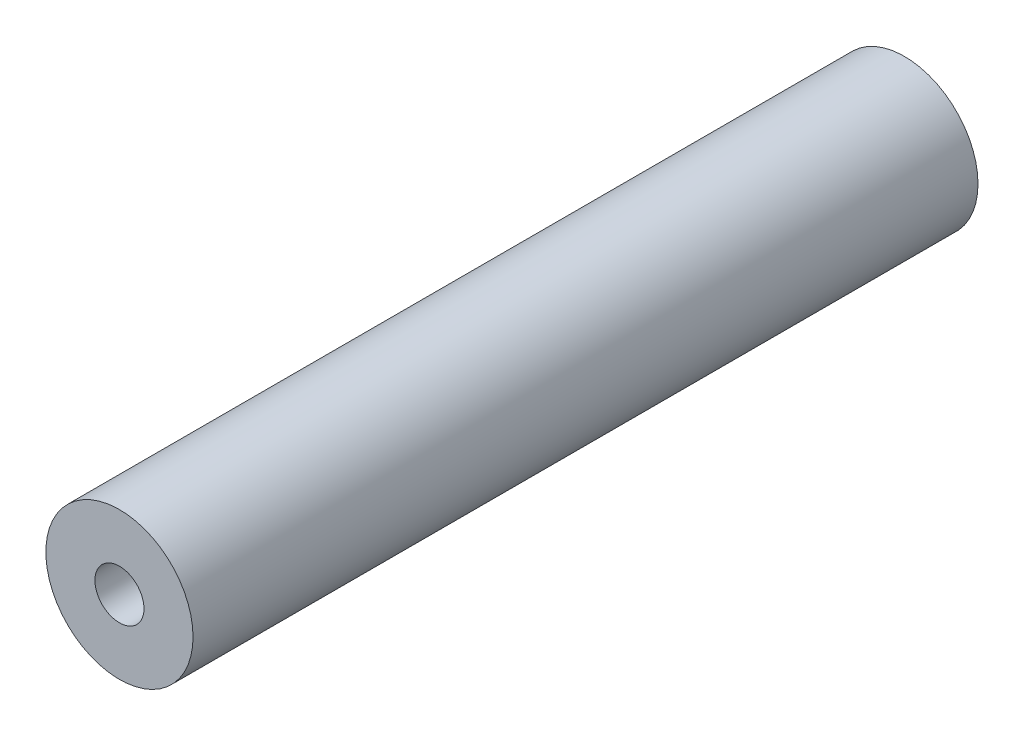
ISO-10303-21;
HEADER;
FILE_DESCRIPTION(('STEP AP214'),'2;1');
FILE_NAME('part.step','',(''),(''),'','','');
FILE_SCHEMA(('AUTOMOTIVE_DESIGN { 1 0 10303 214 1 1 1 1 }'));
ENDSEC;
DATA;
#1=APPLICATION_CONTEXT('core data for automotive mechanical design processes');
#2=APPLICATION_PROTOCOL_DEFINITION('international standard','automotive_design',2000,#1);
#3=PRODUCT_CONTEXT('',#1,'mechanical');
#4=PRODUCT('Part','Part','',(#3));
#5=PRODUCT_RELATED_PRODUCT_CATEGORY('part','',(#4));
#6=PRODUCT_DEFINITION_FORMATION('','',#4);
#7=PRODUCT_DEFINITION_CONTEXT('part definition',#1,'design');
#8=PRODUCT_DEFINITION('design','',#6,#7);
#9=PRODUCT_DEFINITION_SHAPE('','',#8);
#10=(LENGTH_UNIT() NAMED_UNIT(*) SI_UNIT(.MILLI.,.METRE.));
#11=(NAMED_UNIT(*) PLANE_ANGLE_UNIT() SI_UNIT($,.RADIAN.));
#12=(NAMED_UNIT(*) SI_UNIT($,.STERADIAN.) SOLID_ANGLE_UNIT());
#13=UNCERTAINTY_MEASURE_WITH_UNIT(LENGTH_MEASURE(1.E-05),#10,'distance_accuracy_value','');
#14=(GEOMETRIC_REPRESENTATION_CONTEXT(3) GLOBAL_UNCERTAINTY_ASSIGNED_CONTEXT((#13)) GLOBAL_UNIT_ASSIGNED_CONTEXT((#10,
#11,#12)) REPRESENTATION_CONTEXT('',''));
#15=CARTESIAN_POINT('',(0.,0.,0.));
#16=DIRECTION('',(0.,0.,1.));
#17=DIRECTION('',(1.,0.,0.));
#18=AXIS2_PLACEMENT_3D('',#15,#16,#17);
#19=CARTESIAN_POINT('',(0.,0.,50.8));
#20=DIRECTION('',(0.,0.,1.));
#21=DIRECTION('',(1.,0.,0.));
#22=AXIS2_PLACEMENT_3D('',#19,#20,#21);
#23=PLANE('',#22);
#24=CARTESIAN_POINT('',(0.,0.,50.8));
#25=DIRECTION('',(0.,0.,1.));
#26=DIRECTION('',(1.,0.,0.));
#27=AXIS2_PLACEMENT_3D('',#24,#25,#26);
#28=CIRCLE('',#27,4.7625);
#29=CARTESIAN_POINT('',(4.7625,0.,50.8));
#30=VERTEX_POINT('',#29);
#31=EDGE_CURVE('E10',#30,#30,#28,.T.);
#32=ORIENTED_EDGE('',*,*,#31,.T.);
#33=EDGE_LOOP('',(#32));
#34=FACE_BOUND('',#33,.T.);
#35=CARTESIAN_POINT('',(0.,0.,50.8));
#36=DIRECTION('',(0.,0.,1.));
#37=DIRECTION('',(1.,0.,0.));
#38=AXIS2_PLACEMENT_3D('',#35,#36,#37);
#39=CIRCLE('',#38,1.5875);
#40=CARTESIAN_POINT('',(1.5875,0.,50.8));
#41=VERTEX_POINT('',#40);
#42=EDGE_CURVE('E41',#41,#41,#39,.T.);
#43=ORIENTED_EDGE('',*,*,#42,.F.);
#44=EDGE_LOOP('',(#43));
#45=FACE_BOUND('',#44,.T.);
#46=ADVANCED_FACE('F30',(#34,#45),#23,.T.);
#47=CARTESIAN_POINT('',(0.,0.,0.));
#48=DIRECTION('',(0.,0.,1.));
#49=DIRECTION('',(1.,0.,0.));
#50=AXIS2_PLACEMENT_3D('',#47,#48,#49);
#51=PLANE('',#50);
#52=CARTESIAN_POINT('',(0.,0.,0.));
#53=DIRECTION('',(0.,0.,1.));
#54=DIRECTION('',(1.,0.,0.));
#55=AXIS2_PLACEMENT_3D('',#52,#53,#54);
#56=CIRCLE('',#55,4.7625);
#57=CARTESIAN_POINT('',(4.7625,0.,0.));
#58=VERTEX_POINT('',#57);
#59=EDGE_CURVE('E34',#58,#58,#56,.T.);
#60=ORIENTED_EDGE('',*,*,#59,.F.);
#61=EDGE_LOOP('',(#60));
#62=FACE_BOUND('',#61,.T.);
#63=CARTESIAN_POINT('',(0.,0.,0.));
#64=DIRECTION('',(0.,0.,1.));
#65=DIRECTION('',(1.,0.,0.));
#66=AXIS2_PLACEMENT_3D('',#63,#64,#65);
#67=CIRCLE('',#66,1.5875);
#68=CARTESIAN_POINT('',(1.5875,0.,0.));
#69=VERTEX_POINT('',#68);
#70=EDGE_CURVE('E43',#69,#69,#67,.T.);
#71=ORIENTED_EDGE('',*,*,#70,.T.);
#72=EDGE_LOOP('',(#71));
#73=FACE_BOUND('',#72,.T.);
#74=ADVANCED_FACE('F53',(#62,#73),#51,.F.);
#75=CARTESIAN_POINT('',(0.,0.,50.8));
#76=DIRECTION('',(0.,0.,-1.));
#77=DIRECTION('',(-1.,0.,0.));
#78=AXIS2_PLACEMENT_3D('',#75,#76,#77);
#79=CYLINDRICAL_SURFACE('',#78,4.7625);
#80=ORIENTED_EDGE('',*,*,#31,.F.);
#81=EDGE_LOOP('',(#80));
#82=FACE_BOUND('',#81,.T.);
#83=ORIENTED_EDGE('',*,*,#59,.T.);
#84=EDGE_LOOP('',(#83));
#85=FACE_BOUND('',#84,.T.);
#86=ADVANCED_FACE('F32',(#82,#85),#79,.T.);
#87=CARTESIAN_POINT('',(0.,0.,50.8));
#88=DIRECTION('',(0.,0.,-1.));
#89=DIRECTION('',(-1.,0.,0.));
#90=AXIS2_PLACEMENT_3D('',#87,#88,#89);
#91=CYLINDRICAL_SURFACE('',#90,1.5875);
#92=ORIENTED_EDGE('',*,*,#42,.T.);
#93=EDGE_LOOP('',(#92));
#94=FACE_BOUND('',#93,.T.);
#95=ORIENTED_EDGE('',*,*,#70,.F.);
#96=EDGE_LOOP('',(#95));
#97=FACE_BOUND('',#96,.T.);
#98=ADVANCED_FACE('F49',(#94,#97),#91,.F.);
#99=CLOSED_SHELL('',(#46,#74,#86,#98));
#100=MANIFOLD_SOLID_BREP('B2',#99);
#101=ADVANCED_BREP_SHAPE_REPRESENTATION('',(#18,#100),#14);
#102=SHAPE_DEFINITION_REPRESENTATION(#9,#101);
ENDSEC;
END-ISO-10303-21;
